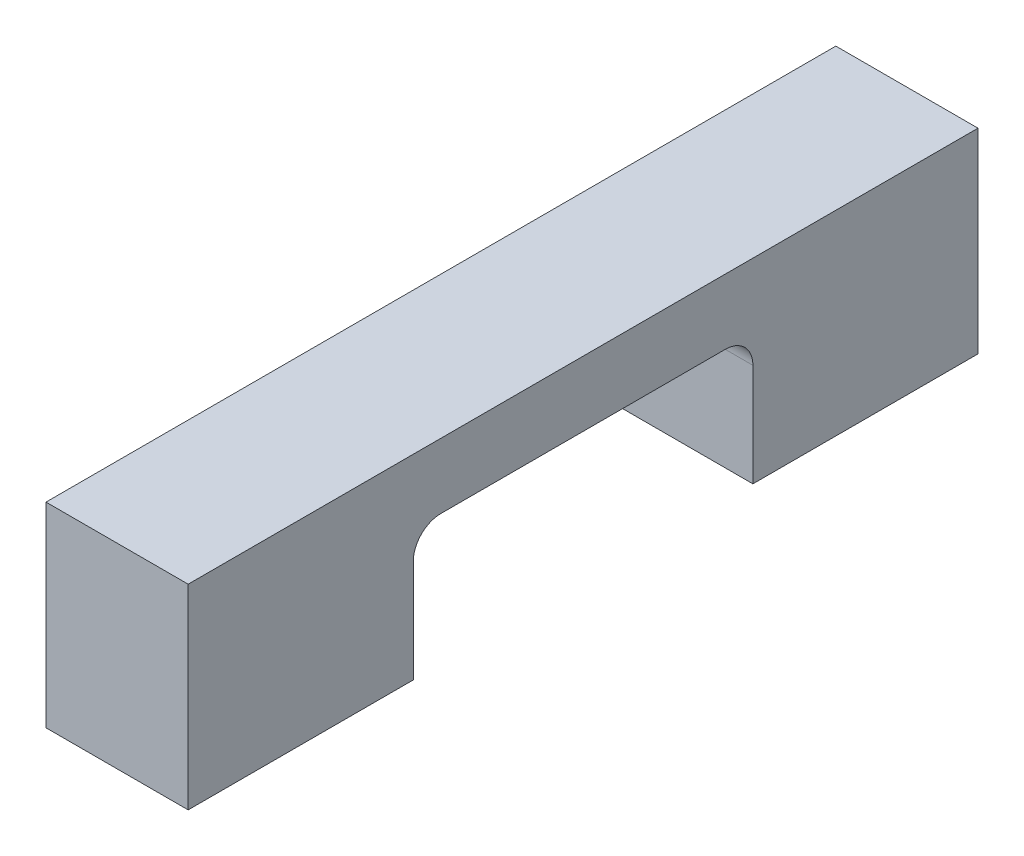
ISO-10303-21;
HEADER;
FILE_DESCRIPTION(('STEP AP214'),'2;1');
FILE_NAME('part.step','',(''),(''),'','','');
FILE_SCHEMA(('AUTOMOTIVE_DESIGN { 1 0 10303 214 1 1 1 1 }'));
ENDSEC;
DATA;
#1=APPLICATION_CONTEXT('core data for automotive mechanical design processes');
#2=APPLICATION_PROTOCOL_DEFINITION('international standard','automotive_design',2000,#1);
#3=PRODUCT_CONTEXT('',#1,'mechanical');
#4=PRODUCT('Part','Part','',(#3));
#5=PRODUCT_RELATED_PRODUCT_CATEGORY('part','',(#4));
#6=PRODUCT_DEFINITION_FORMATION('','',#4);
#7=PRODUCT_DEFINITION_CONTEXT('part definition',#1,'design');
#8=PRODUCT_DEFINITION('design','',#6,#7);
#9=PRODUCT_DEFINITION_SHAPE('','',#8);
#10=(LENGTH_UNIT() NAMED_UNIT(*) SI_UNIT(.MILLI.,.METRE.));
#11=(NAMED_UNIT(*) PLANE_ANGLE_UNIT() SI_UNIT($,.RADIAN.));
#12=(NAMED_UNIT(*) SI_UNIT($,.STERADIAN.) SOLID_ANGLE_UNIT());
#13=UNCERTAINTY_MEASURE_WITH_UNIT(LENGTH_MEASURE(1.E-05),#10,'distance_accuracy_value','');
#14=(GEOMETRIC_REPRESENTATION_CONTEXT(3) GLOBAL_UNCERTAINTY_ASSIGNED_CONTEXT((#13)) GLOBAL_UNIT_ASSIGNED_CONTEXT((#10,
#11,#12)) REPRESENTATION_CONTEXT('',''));
#15=CARTESIAN_POINT('',(0.,0.,0.));
#16=DIRECTION('',(0.,0.,1.));
#17=DIRECTION('',(1.,0.,0.));
#18=AXIS2_PLACEMENT_3D('',#15,#16,#17);
#19=CARTESIAN_POINT('',(0.,3.73318254077837,-0.0100249999999621));
#20=DIRECTION('',(-1.,0.,0.));
#21=DIRECTION('',(0.,0.,1.));
#22=AXIS2_PLACEMENT_3D('',#19,#20,#21);
#23=PLANE('',#22);
#24=DIRECTION('',(0.,0.,1.));
#25=VECTOR('',#24,1.);
#26=CARTESIAN_POINT('',(0.,0.,-0.0100249999999621));
#27=LINE('',#26,#25);
#28=CARTESIAN_POINT('',(0.,0.,0.));
#29=VERTEX_POINT('',#28);
#30=CARTESIAN_POINT('',(0.,0.,50.));
#31=VERTEX_POINT('',#30);
#32=EDGE_CURVE('E125',#29,#31,#27,.T.);
#33=ORIENTED_EDGE('',*,*,#32,.F.);
#34=DIRECTION('',(0.,-1.,0.));
#35=VECTOR('',#34,1.);
#36=CARTESIAN_POINT('',(0.,0.,0.));
#37=LINE('',#36,#35);
#38=CARTESIAN_POINT('',(0.,-12.3756278497692,0.));
#39=VERTEX_POINT('',#38);
#40=EDGE_CURVE('E143',#29,#39,#37,.T.);
#41=ORIENTED_EDGE('',*,*,#40,.T.);
#42=DIRECTION('',(0.,0.,1.));
#43=VECTOR('',#42,1.);
#44=CARTESIAN_POINT('',(0.,-12.3756278497692,50.));
#45=LINE('',#44,#43);
#46=CARTESIAN_POINT('',(0.,-12.3756278497629,14.2500000000001));
#47=VERTEX_POINT('',#46);
#48=EDGE_CURVE('E148',#39,#47,#45,.T.);
#49=ORIENTED_EDGE('',*,*,#48,.T.);
#50=DIRECTION('',(0.,-1.,0.));
#51=VECTOR('',#50,1.);
#52=CARTESIAN_POINT('',(0.,-5.87562784976239,14.2500000000001));
#53=LINE('',#52,#51);
#54=CARTESIAN_POINT('',(0.,-5.87562784976239,14.2500000000001));
#55=VERTEX_POINT('',#54);
#56=EDGE_CURVE('E48',#55,#47,#53,.T.);
#57=ORIENTED_EDGE('',*,*,#56,.F.);
#58=CARTESIAN_POINT('',(0.,-5.87562784976239,16.0000000000001));
#59=DIRECTION('',(-1.,0.,0.));
#60=DIRECTION('',(0.,0.,1.));
#61=AXIS2_PLACEMENT_3D('',#58,#59,#60);
#62=CIRCLE('',#61,1.75);
#63=CARTESIAN_POINT('',(0.,-4.12562784976239,16.0000000000001));
#64=VERTEX_POINT('',#63);
#65=EDGE_CURVE('E193',#64,#55,#62,.T.);
#66=ORIENTED_EDGE('',*,*,#65,.F.);
#67=DIRECTION('',(0.,0.,-1.));
#68=VECTOR('',#67,1.);
#69=CARTESIAN_POINT('',(0.,-4.12562784976239,34.0000000000001));
#70=LINE('',#69,#68);
#71=CARTESIAN_POINT('',(0.,-4.12562784976239,34.0000000000001));
#72=VERTEX_POINT('',#71);
#73=EDGE_CURVE('E182',#72,#64,#70,.T.);
#74=ORIENTED_EDGE('',*,*,#73,.F.);
#75=CARTESIAN_POINT('',(0.,-5.87562784976239,34.0000000000001));
#76=DIRECTION('',(-1.,0.,0.));
#77=DIRECTION('',(0.,0.,1.));
#78=AXIS2_PLACEMENT_3D('',#75,#76,#77);
#79=CIRCLE('',#78,1.75);
#80=CARTESIAN_POINT('',(0.,-5.87562784976239,35.7500000000001));
#81=VERTEX_POINT('',#80);
#82=EDGE_CURVE('E176',#81,#72,#79,.T.);
#83=ORIENTED_EDGE('',*,*,#82,.F.);
#84=DIRECTION('',(0.,1.,0.));
#85=VECTOR('',#84,1.);
#86=CARTESIAN_POINT('',(0.,-12.3756278497629,35.7500000000001));
#87=LINE('',#86,#85);
#88=CARTESIAN_POINT('',(0.,-12.3756278497629,35.7500000000001));
#89=VERTEX_POINT('',#88);
#90=EDGE_CURVE('E135',#89,#81,#87,.T.);
#91=ORIENTED_EDGE('',*,*,#90,.F.);
#92=DIRECTION('',(0.,0.,1.));
#93=VECTOR('',#92,1.);
#94=CARTESIAN_POINT('',(0.,-12.3756278497692,50.));
#95=LINE('',#94,#93);
#96=CARTESIAN_POINT('',(0.,-12.3756278497692,50.));
#97=VERTEX_POINT('',#96);
#98=EDGE_CURVE('E132',#89,#97,#95,.T.);
#99=ORIENTED_EDGE('',*,*,#98,.T.);
#100=DIRECTION('',(0.,-1.,0.));
#101=VECTOR('',#100,1.);
#102=CARTESIAN_POINT('',(0.,0.,50.));
#103=LINE('',#102,#101);
#104=EDGE_CURVE('E115',#31,#97,#103,.T.);
#105=ORIENTED_EDGE('',*,*,#104,.F.);
#106=EDGE_LOOP('',(#33,#41,#49,#57,#66,#74,#83,#91,#99,#105));
#107=FACE_BOUND('',#106,.T.);
#108=ADVANCED_FACE('F33',(#107),#23,.T.);
#109=CARTESIAN_POINT('',(9.,3.73318254077837,-0.0100249999999621));
#110=DIRECTION('',(1.,0.,0.));
#111=DIRECTION('',(0.,1.,0.));
#112=AXIS2_PLACEMENT_3D('',#109,#110,#111);
#113=PLANE('',#112);
#114=DIRECTION('',(0.,0.,-1.));
#115=VECTOR('',#114,1.);
#116=CARTESIAN_POINT('',(9.,0.,-0.0100249999999621));
#117=LINE('',#116,#115);
#118=CARTESIAN_POINT('',(9.,0.,50.));
#119=VERTEX_POINT('',#118);
#120=CARTESIAN_POINT('',(9.,0.,0.));
#121=VERTEX_POINT('',#120);
#122=EDGE_CURVE('E129',#119,#121,#117,.T.);
#123=ORIENTED_EDGE('',*,*,#122,.F.);
#124=DIRECTION('',(0.,1.,0.));
#125=VECTOR('',#124,1.);
#126=CARTESIAN_POINT('',(9.,0.,50.));
#127=LINE('',#126,#125);
#128=CARTESIAN_POINT('',(9.,-12.3756278497692,50.));
#129=VERTEX_POINT('',#128);
#130=EDGE_CURVE('E117',#129,#119,#127,.T.);
#131=ORIENTED_EDGE('',*,*,#130,.F.);
#132=DIRECTION('',(0.,0.,-1.));
#133=VECTOR('',#132,1.);
#134=CARTESIAN_POINT('',(9.,-12.3756278497692,50.));
#135=LINE('',#134,#133);
#136=CARTESIAN_POINT('',(9.,-12.3756278497629,35.7500000000001));
#137=VERTEX_POINT('',#136);
#138=EDGE_CURVE('E137',#129,#137,#135,.T.);
#139=ORIENTED_EDGE('',*,*,#138,.T.);
#140=DIRECTION('',(0.,-1.,0.));
#141=VECTOR('',#140,1.);
#142=CARTESIAN_POINT('',(9.,-12.3756278497629,35.7500000000001));
#143=LINE('',#142,#141);
#144=CARTESIAN_POINT('',(9.,-5.87562784976239,35.7500000000001));
#145=VERTEX_POINT('',#144);
#146=EDGE_CURVE('E172',#145,#137,#143,.T.);
#147=ORIENTED_EDGE('',*,*,#146,.F.);
#148=CARTESIAN_POINT('',(9.,-5.87562784976239,34.0000000000001));
#149=DIRECTION('',(1.,0.,0.));
#150=DIRECTION('',(0.,1.,0.));
#151=AXIS2_PLACEMENT_3D('',#148,#149,#150);
#152=CIRCLE('',#151,1.75);
#153=CARTESIAN_POINT('',(9.,-4.12562784976239,34.0000000000001));
#154=VERTEX_POINT('',#153);
#155=EDGE_CURVE('E179',#154,#145,#152,.T.);
#156=ORIENTED_EDGE('',*,*,#155,.F.);
#157=DIRECTION('',(0.,0.,1.));
#158=VECTOR('',#157,1.);
#159=CARTESIAN_POINT('',(9.,-4.12562784976239,34.0000000000001));
#160=LINE('',#159,#158);
#161=CARTESIAN_POINT('',(9.,-4.12562784976239,16.0000000000001));
#162=VERTEX_POINT('',#161);
#163=EDGE_CURVE('E191',#162,#154,#160,.T.);
#164=ORIENTED_EDGE('',*,*,#163,.F.);
#165=CARTESIAN_POINT('',(9.,-5.87562784976239,16.0000000000001));
#166=DIRECTION('',(1.,0.,0.));
#167=DIRECTION('',(0.,1.,0.));
#168=AXIS2_PLACEMENT_3D('',#165,#166,#167);
#169=CIRCLE('',#168,1.75);
#170=CARTESIAN_POINT('',(9.,-5.87562784976239,14.2500000000001));
#171=VERTEX_POINT('',#170);
#172=EDGE_CURVE('E195',#171,#162,#169,.T.);
#173=ORIENTED_EDGE('',*,*,#172,.F.);
#174=DIRECTION('',(0.,1.,0.));
#175=VECTOR('',#174,1.);
#176=CARTESIAN_POINT('',(9.,-5.87562784976239,14.2500000000001));
#177=LINE('',#176,#175);
#178=CARTESIAN_POINT('',(9.,-12.3756278497629,14.2500000000001));
#179=VERTEX_POINT('',#178);
#180=EDGE_CURVE('E56',#179,#171,#177,.T.);
#181=ORIENTED_EDGE('',*,*,#180,.F.);
#182=DIRECTION('',(0.,0.,-1.));
#183=VECTOR('',#182,1.);
#184=CARTESIAN_POINT('',(9.,-12.3756278497692,50.));
#185=LINE('',#184,#183);
#186=CARTESIAN_POINT('',(9.,-12.3756278497692,0.));
#187=VERTEX_POINT('',#186);
#188=EDGE_CURVE('E128',#179,#187,#185,.T.);
#189=ORIENTED_EDGE('',*,*,#188,.T.);
#190=DIRECTION('',(0.,1.,0.));
#191=VECTOR('',#190,1.);
#192=CARTESIAN_POINT('',(9.,0.,0.));
#193=LINE('',#192,#191);
#194=EDGE_CURVE('E145',#187,#121,#193,.T.);
#195=ORIENTED_EDGE('',*,*,#194,.T.);
#196=EDGE_LOOP('',(#123,#131,#139,#147,#156,#164,#173,#181,#189,#195));
#197=FACE_BOUND('',#196,.T.);
#198=ADVANCED_FACE('F184',(#197),#113,.T.);
#199=CARTESIAN_POINT('',(0.,0.,50.));
#200=DIRECTION('',(0.,1.,0.));
#201=DIRECTION('',(0.,0.,1.));
#202=AXIS2_PLACEMENT_3D('',#199,#200,#201);
#203=PLANE('',#202);
#204=DIRECTION('',(1.,0.,0.));
#205=VECTOR('',#204,1.);
#206=CARTESIAN_POINT('',(0.,0.,0.));
#207=LINE('',#206,#205);
#208=EDGE_CURVE('E121',#29,#121,#207,.T.);
#209=ORIENTED_EDGE('',*,*,#208,.F.);
#210=ORIENTED_EDGE('',*,*,#32,.T.);
#211=DIRECTION('',(1.,0.,0.));
#212=VECTOR('',#211,1.);
#213=CARTESIAN_POINT('',(0.,0.,50.));
#214=LINE('',#213,#212);
#215=EDGE_CURVE('E110',#31,#119,#214,.T.);
#216=ORIENTED_EDGE('',*,*,#215,.T.);
#217=ORIENTED_EDGE('',*,*,#122,.T.);
#218=EDGE_LOOP('',(#209,#210,#216,#217));
#219=FACE_BOUND('',#218,.T.);
#220=ADVANCED_FACE('F126',(#219),#203,.T.);
#221=CARTESIAN_POINT('',(0.,0.,0.));
#222=DIRECTION('',(0.,0.,1.));
#223=DIRECTION('',(1.,0.,0.));
#224=AXIS2_PLACEMENT_3D('',#221,#222,#223);
#225=PLANE('',#224);
#226=ORIENTED_EDGE('',*,*,#40,.F.);
#227=ORIENTED_EDGE('',*,*,#208,.T.);
#228=ORIENTED_EDGE('',*,*,#194,.F.);
#229=DIRECTION('',(1.,0.,0.));
#230=VECTOR('',#229,1.);
#231=CARTESIAN_POINT('',(-20.5,-12.3756278497692,0.));
#232=LINE('',#231,#230);
#233=EDGE_CURVE('E122',#39,#187,#232,.T.);
#234=ORIENTED_EDGE('',*,*,#233,.F.);
#235=EDGE_LOOP('',(#226,#227,#228,#234));
#236=FACE_BOUND('',#235,.T.);
#237=ADVANCED_FACE('F35',(#236),#225,.F.);
#238=CARTESIAN_POINT('',(0.,0.,50.));
#239=DIRECTION('',(0.,0.,1.));
#240=DIRECTION('',(1.,0.,0.));
#241=AXIS2_PLACEMENT_3D('',#238,#239,#240);
#242=PLANE('',#241);
#243=ORIENTED_EDGE('',*,*,#215,.F.);
#244=ORIENTED_EDGE('',*,*,#104,.T.);
#245=DIRECTION('',(1.,0.,0.));
#246=VECTOR('',#245,1.);
#247=CARTESIAN_POINT('',(-20.5,-12.3756278497692,50.));
#248=LINE('',#247,#246);
#249=EDGE_CURVE('E152',#97,#129,#248,.T.);
#250=ORIENTED_EDGE('',*,*,#249,.T.);
#251=ORIENTED_EDGE('',*,*,#130,.T.);
#252=EDGE_LOOP('',(#243,#244,#250,#251));
#253=FACE_BOUND('',#252,.T.);
#254=ADVANCED_FACE('F112',(#253),#242,.T.);
#255=CARTESIAN_POINT('',(-20.5,-12.3756278497692,50.));
#256=DIRECTION('',(0.,1.,0.));
#257=DIRECTION('',(0.,0.,1.));
#258=AXIS2_PLACEMENT_3D('',#255,#256,#257);
#259=PLANE('',#258);
#260=ORIENTED_EDGE('',*,*,#98,.F.);
#261=DIRECTION('',(1.,0.,0.));
#262=VECTOR('',#261,1.);
#263=CARTESIAN_POINT('',(19.5,-12.3756278497629,35.7500000000001));
#264=LINE('',#263,#262);
#265=EDGE_CURVE('E11',#89,#137,#264,.T.);
#266=ORIENTED_EDGE('',*,*,#265,.T.);
#267=ORIENTED_EDGE('',*,*,#138,.F.);
#268=ORIENTED_EDGE('',*,*,#249,.F.);
#269=EDGE_LOOP('',(#260,#266,#267,#268));
#270=FACE_BOUND('',#269,.T.);
#271=ADVANCED_FACE('F221',(#270),#259,.F.);
#272=CARTESIAN_POINT('',(19.5,-12.3756278497629,35.7500000000001));
#273=DIRECTION('',(0.,0.,-1.));
#274=DIRECTION('',(-1.,0.,0.));
#275=AXIS2_PLACEMENT_3D('',#272,#273,#274);
#276=PLANE('',#275);
#277=ORIENTED_EDGE('',*,*,#265,.F.);
#278=ORIENTED_EDGE('',*,*,#90,.T.);
#279=DIRECTION('',(1.,0.,0.));
#280=VECTOR('',#279,1.);
#281=CARTESIAN_POINT('',(19.5,-5.87562784976239,35.7500000000001));
#282=LINE('',#281,#280);
#283=EDGE_CURVE('E41',#81,#145,#282,.T.);
#284=ORIENTED_EDGE('',*,*,#283,.T.);
#285=ORIENTED_EDGE('',*,*,#146,.T.);
#286=EDGE_LOOP('',(#277,#278,#284,#285));
#287=FACE_BOUND('',#286,.T.);
#288=ADVANCED_FACE('F170',(#287),#276,.T.);
#289=CARTESIAN_POINT('',(19.5,-5.87562784976239,34.0000000000001));
#290=DIRECTION('',(1.,0.,0.));
#291=DIRECTION('',(0.,0.,-1.));
#292=AXIS2_PLACEMENT_3D('',#289,#290,#291);
#293=CYLINDRICAL_SURFACE('',#292,1.75);
#294=ORIENTED_EDGE('',*,*,#283,.F.);
#295=ORIENTED_EDGE('',*,*,#82,.T.);
#296=DIRECTION('',(1.,0.,0.));
#297=VECTOR('',#296,1.);
#298=CARTESIAN_POINT('',(19.5,-4.12562784976239,34.0000000000001));
#299=LINE('',#298,#297);
#300=EDGE_CURVE('E163',#72,#154,#299,.T.);
#301=ORIENTED_EDGE('',*,*,#300,.T.);
#302=ORIENTED_EDGE('',*,*,#155,.T.);
#303=EDGE_LOOP('',(#294,#295,#301,#302));
#304=FACE_BOUND('',#303,.T.);
#305=ADVANCED_FACE('F175',(#304),#293,.F.);
#306=CARTESIAN_POINT('',(19.5,-4.12562784976239,34.0000000000001));
#307=DIRECTION('',(0.,-1.,0.));
#308=DIRECTION('',(0.,0.,-1.));
#309=AXIS2_PLACEMENT_3D('',#306,#307,#308);
#310=PLANE('',#309);
#311=ORIENTED_EDGE('',*,*,#300,.F.);
#312=ORIENTED_EDGE('',*,*,#73,.T.);
#313=DIRECTION('',(1.,0.,0.));
#314=VECTOR('',#313,1.);
#315=CARTESIAN_POINT('',(19.5,-4.12562784976239,16.0000000000001));
#316=LINE('',#315,#314);
#317=EDGE_CURVE('E160',#64,#162,#316,.T.);
#318=ORIENTED_EDGE('',*,*,#317,.T.);
#319=ORIENTED_EDGE('',*,*,#163,.T.);
#320=EDGE_LOOP('',(#311,#312,#318,#319));
#321=FACE_BOUND('',#320,.T.);
#322=ADVANCED_FACE('F213',(#321),#310,.T.);
#323=ORIENTED_EDGE('',*,*,#48,.F.);
#324=ORIENTED_EDGE('',*,*,#233,.T.);
#325=ORIENTED_EDGE('',*,*,#188,.F.);
#326=DIRECTION('',(1.,0.,0.));
#327=VECTOR('',#326,1.);
#328=CARTESIAN_POINT('',(19.5,-12.3756278497629,14.2500000000001));
#329=LINE('',#328,#327);
#330=EDGE_CURVE('E155',#47,#179,#329,.T.);
#331=ORIENTED_EDGE('',*,*,#330,.F.);
#332=EDGE_LOOP('',(#323,#324,#325,#331));
#333=FACE_BOUND('',#332,.T.);
#334=ADVANCED_FACE('F207',(#333),#259,.F.);
#335=CARTESIAN_POINT('',(19.5,-5.87562784976239,16.0000000000001));
#336=DIRECTION('',(1.,0.,0.));
#337=DIRECTION('',(0.,0.,-1.));
#338=AXIS2_PLACEMENT_3D('',#335,#336,#337);
#339=CYLINDRICAL_SURFACE('',#338,1.75);
#340=ORIENTED_EDGE('',*,*,#317,.F.);
#341=ORIENTED_EDGE('',*,*,#65,.T.);
#342=DIRECTION('',(1.,0.,0.));
#343=VECTOR('',#342,1.);
#344=CARTESIAN_POINT('',(19.5,-5.87562784976239,14.2500000000001));
#345=LINE('',#344,#343);
#346=EDGE_CURVE('E157',#55,#171,#345,.T.);
#347=ORIENTED_EDGE('',*,*,#346,.T.);
#348=ORIENTED_EDGE('',*,*,#172,.T.);
#349=EDGE_LOOP('',(#340,#341,#347,#348));
#350=FACE_BOUND('',#349,.T.);
#351=ADVANCED_FACE('F211',(#350),#339,.F.);
#352=CARTESIAN_POINT('',(19.5,-5.87562784976239,14.2500000000001));
#353=DIRECTION('',(0.,0.,1.));
#354=DIRECTION('',(1.,0.,0.));
#355=AXIS2_PLACEMENT_3D('',#352,#353,#354);
#356=PLANE('',#355);
#357=ORIENTED_EDGE('',*,*,#346,.F.);
#358=ORIENTED_EDGE('',*,*,#56,.T.);
#359=ORIENTED_EDGE('',*,*,#330,.T.);
#360=ORIENTED_EDGE('',*,*,#180,.T.);
#361=EDGE_LOOP('',(#357,#358,#359,#360));
#362=FACE_BOUND('',#361,.T.);
#363=ADVANCED_FACE('F208',(#362),#356,.T.);
#364=CLOSED_SHELL('',(#108,#198,#220,#237,#254,#271,#288,#305,#322,#334,#351,#363));
#365=MANIFOLD_SOLID_BREP('B2',#364);
#366=ADVANCED_BREP_SHAPE_REPRESENTATION('',(#18,#365),#14);
#367=SHAPE_DEFINITION_REPRESENTATION(#9,#366);
ENDSEC;
END-ISO-10303-21;
